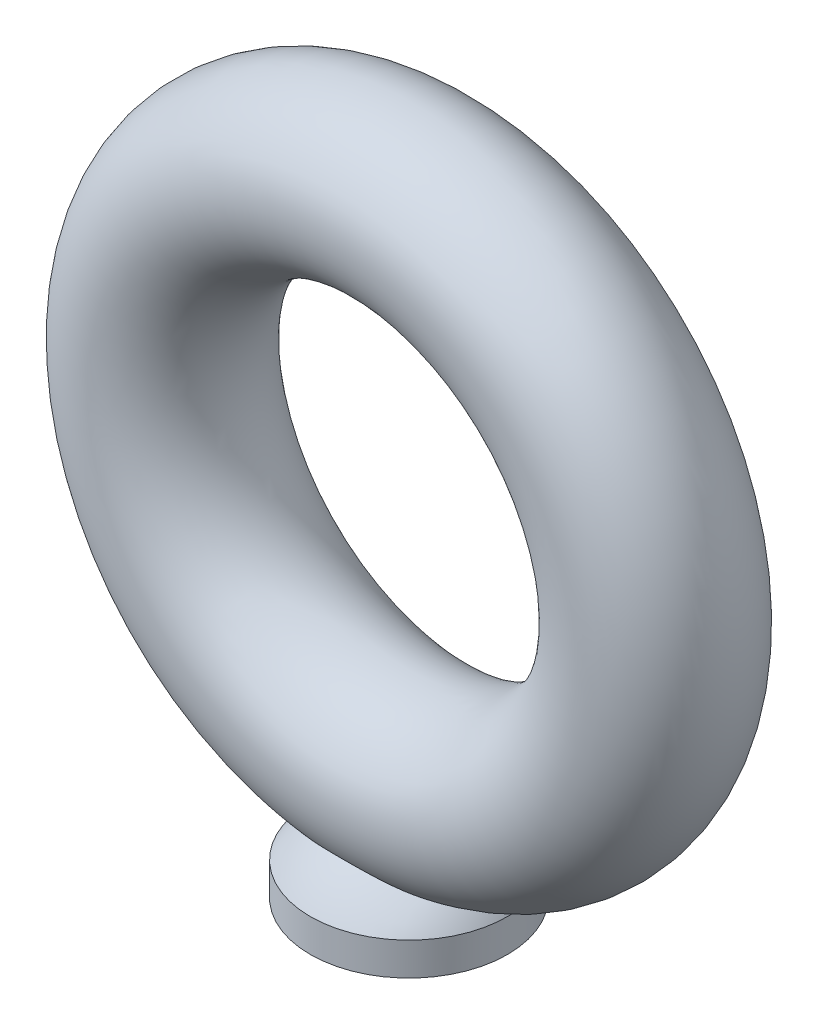
ISO-10303-21;
HEADER;
FILE_DESCRIPTION(('STEP AP214'),'2;1');
FILE_NAME('part.step','',(''),(''),'','','');
FILE_SCHEMA(('AUTOMOTIVE_DESIGN { 1 0 10303 214 1 1 1 1 }'));
ENDSEC;
DATA;
#1=APPLICATION_CONTEXT('core data for automotive mechanical design processes');
#2=APPLICATION_PROTOCOL_DEFINITION('international standard','automotive_design',2000,#1);
#3=PRODUCT_CONTEXT('',#1,'mechanical');
#4=PRODUCT('Part','Part','',(#3));
#5=PRODUCT_RELATED_PRODUCT_CATEGORY('part','',(#4));
#6=PRODUCT_DEFINITION_FORMATION('','',#4);
#7=PRODUCT_DEFINITION_CONTEXT('part definition',#1,'design');
#8=PRODUCT_DEFINITION('design','',#6,#7);
#9=PRODUCT_DEFINITION_SHAPE('','',#8);
#10=(LENGTH_UNIT() NAMED_UNIT(*) SI_UNIT(.MILLI.,.METRE.));
#11=(NAMED_UNIT(*) PLANE_ANGLE_UNIT() SI_UNIT($,.RADIAN.));
#12=(NAMED_UNIT(*) SI_UNIT($,.STERADIAN.) SOLID_ANGLE_UNIT());
#13=UNCERTAINTY_MEASURE_WITH_UNIT(LENGTH_MEASURE(1.E-05),#10,'distance_accuracy_value','');
#14=(GEOMETRIC_REPRESENTATION_CONTEXT(3) GLOBAL_UNCERTAINTY_ASSIGNED_CONTEXT((#13)) GLOBAL_UNIT_ASSIGNED_CONTEXT((#10,
#11,#12)) REPRESENTATION_CONTEXT('',''));
#15=CARTESIAN_POINT('',(0.,0.,0.));
#16=DIRECTION('',(0.,0.,1.));
#17=DIRECTION('',(1.,0.,0.));
#18=AXIS2_PLACEMENT_3D('',#15,#16,#17);
#19=CARTESIAN_POINT('',(0.,47.625,0.));
#20=DIRECTION('',(0.,1.,0.));
#21=DIRECTION('',(0.,0.,1.));
#22=AXIS2_PLACEMENT_3D('',#19,#20,#21);
#23=PLANE('',#22);
#24=CARTESIAN_POINT('',(0.,47.625,0.));
#25=DIRECTION('',(0.,-1.,0.));
#26=DIRECTION('',(0.,0.,-1.));
#27=AXIS2_PLACEMENT_3D('',#24,#25,#26);
#28=CIRCLE('',#27,4.7625);
#29=CARTESIAN_POINT('',(0.,47.625,-4.7625));
#30=VERTEX_POINT('',#29);
#31=EDGE_CURVE('E10',#30,#30,#28,.F.);
#32=ORIENTED_EDGE('',*,*,#31,.F.);
#33=EDGE_LOOP('',(#32));
#34=FACE_BOUND('',#33,.T.);
#35=ADVANCED_FACE('F43',(#34),#23,.F.);
#36=CARTESIAN_POINT('',(0.,65.0875,0.));
#37=DIRECTION('',(0.,0.,-1.));
#38=DIRECTION('',(-1.,0.,0.));
#39=AXIS2_PLACEMENT_3D('',#36,#37,#38);
#40=TOROIDAL_SURFACE('',#39,11.90625,3.96875);
#41=CARTESIAN_POINT('',(-3.08254351748566,50.3024240932503,-2.35197364086265));
#42=CARTESIAN_POINT('',(-2.98323900620474,50.3360213661932,-2.42422682434512));
#43=CARTESIAN_POINT('',(-2.88013085526119,50.3695590508059,-2.49121885892036));
#44=CARTESIAN_POINT('',(-2.66757504253659,50.4353566365679,-2.61511560413417));
#45=CARTESIAN_POINT('',(-2.5581237343341,50.4676157844336,-2.6720144347398));
#46=CARTESIAN_POINT('',(-2.33387453628399,50.5298358133464,-2.77631967020259));
#47=CARTESIAN_POINT('',(-2.2190652895459,50.559791419741,-2.82370466751601));
#48=CARTESIAN_POINT('',(-1.98536470315413,50.6163797260913,-2.90943601767067));
#49=CARTESIAN_POINT('',(-1.86647395179116,50.6430129023849,-2.94778366690226));
#50=CARTESIAN_POINT('',(-1.6265350316443,50.6919402792694,-3.01577583199314));
#51=CARTESIAN_POINT('',(-1.50551473902482,50.7142703118461,-3.04549336737173));
#52=CARTESIAN_POINT('',(-1.26108413917767,50.7542277139034,-3.09723231569982));
#53=CARTESIAN_POINT('',(-1.13767382490844,50.7718550695265,-3.11925370597103));
#54=CARTESIAN_POINT('',(-0.889224781194679,50.8018900136239,-3.15606193508245));
#55=CARTESIAN_POINT('',(-0.764186978633435,50.8143004497207,-3.17085272142225));
#56=CARTESIAN_POINT('',(-0.513061769559954,50.8335602457176,-3.19356299922371));
#57=CARTESIAN_POINT('',(-0.386974295520307,50.8404092450026,-3.20148204510987));
#58=CARTESIAN_POINT('',(-0.113139153931936,50.8490109200845,-3.21141606924612));
#59=CARTESIAN_POINT('',(0.0346881073914115,50.8497138838034,-3.21221539812763));
#60=CARTESIAN_POINT('',(0.329957871035442,50.8432236928687,-3.20473784428457));
#61=CARTESIAN_POINT('',(0.477400311437924,50.8360293376319,-3.19645958154691));
#62=CARTESIAN_POINT('',(0.77096716537377,50.8140214826774,-3.170537235227));
#63=CARTESIAN_POINT('',(0.917090868553502,50.7992041000513,-3.15288837843911));
#64=CARTESIAN_POINT('',(1.2068867008809,50.7625300339029,-3.10766175714483));
#65=CARTESIAN_POINT('',(1.35055928097147,50.740674660219,-3.08008584004837));
#66=CARTESIAN_POINT('',(1.61224879264925,50.6946736966398,-3.01934534193814));
#67=CARTESIAN_POINT('',(1.73077962122916,50.6714134282128,-2.98771771992849));
#68=CARTESIAN_POINT('',(1.96458073150071,50.6211486910837,-2.91625168244878));
#69=CARTESIAN_POINT('',(2.07985007047717,50.5941431528786,-2.87641092003966));
#70=CARTESIAN_POINT('',(2.30604860964035,50.5372254603831,-2.78800409491287));
#71=CARTESIAN_POINT('',(2.41698457070242,50.5073181101203,-2.73945234400102));
#72=CARTESIAN_POINT('',(2.63370411156787,50.4454762321496,-2.633036433247));
#73=CARTESIAN_POINT('',(2.73948753995918,50.4135416449328,-2.5751719999576));
#74=CARTESIAN_POINT('',(2.9997951731237,50.3312691829305,-2.41598632900276));
#75=CARTESIAN_POINT('',(3.15011624076264,50.2802264156832,-2.30797840401908));
#76=CARTESIAN_POINT('',(3.43091915698975,50.1800120436636,-2.0679835174725));
#77=CARTESIAN_POINT('',(3.56142338735529,50.1308383756635,-1.93602398320573));
#78=CARTESIAN_POINT('',(3.77793587024799,50.0464391425933,-1.67224075274156));
#79=CARTESIAN_POINT('',(3.86772687373571,50.0102439343324,-1.54384600092241));
#80=CARTESIAN_POINT('',(4.02590197356534,49.9452111201476,-1.272705449838));
#81=CARTESIAN_POINT('',(4.09429325249381,49.9163710461545,-1.12996448702182));
#82=CARTESIAN_POINT('',(4.2067204755041,49.8684048863484,-0.832668653452249));
#83=CARTESIAN_POINT('',(4.25062357495865,49.8493318299839,-0.678054423684553));
#84=CARTESIAN_POINT('',(4.31104873058692,49.8229716396619,-0.362581254168845));
#85=CARTESIAN_POINT('',(4.32758234656288,49.8156795299235,-0.201724980211858));
#86=CARTESIAN_POINT('',(4.33210648316943,49.8136876657442,0.104844256498268));
#87=CARTESIAN_POINT('',(4.32270112211044,49.8178390337092,0.250518306367766));
#88=CARTESIAN_POINT('',(4.28127538068227,49.8359756446295,0.537947191617793));
#89=CARTESIAN_POINT('',(4.24925870643447,49.8499592760199,0.679702665318849));
#90=CARTESIAN_POINT('',(4.16460219182563,49.8864313816903,0.953844533788829));
#91=CARTESIAN_POINT('',(4.11220825243776,49.9088183412131,1.08632120618424));
#92=CARTESIAN_POINT('',(3.98893736841063,49.960484662226,1.3408682250622));
#93=CARTESIAN_POINT('',(3.91805659998418,49.9897654495029,1.4629364117304));
#94=CARTESIAN_POINT('',(3.75344472935765,50.0560535946237,1.70482039563129));
#95=CARTESIAN_POINT('',(3.65826476899288,50.0935108804176,1.82352214552297));
#96=CARTESIAN_POINT('',(3.45227860403745,50.1716985292895,2.04517424877357));
#97=CARTESIAN_POINT('',(3.34146337458692,50.2124307768312,2.14811543288703));
#98=CARTESIAN_POINT('',(3.0546132818696,50.313124158797,2.38065783919074));
#99=CARTESIAN_POINT('',(2.87161842880009,50.3735159223365,2.50150869346071));
#100=CARTESIAN_POINT('',(2.48667739418103,50.4891713239009,2.71167199061192));
#101=CARTESIAN_POINT('',(2.28469036177215,50.5444233747835,2.80091438695586));
#102=CARTESIAN_POINT('',(1.94498305570274,50.6257710655533,2.92330062174467));
#103=CARTESIAN_POINT('',(1.81100402440017,50.65510868917,2.96499889368602));
#104=CARTESIAN_POINT('',(1.53914682219947,50.7084237679269,3.0379784155506));
#105=CARTESIAN_POINT('',(1.40126767309999,50.7323998646529,3.06925702649477));
#106=CARTESIAN_POINT('',(1.12275006223116,50.7740788900322,3.12216068821156));
#107=CARTESIAN_POINT('',(0.982111474602416,50.7917815318447,3.14378529758671));
#108=CARTESIAN_POINT('',(0.69905975461029,50.8202613929095,3.17799954275728));
#109=CARTESIAN_POINT('',(0.556646745553719,50.831039090679,3.19058980283784));
#110=CARTESIAN_POINT('',(0.269644892286703,50.8453375948838,3.20720410396355));
#111=CARTESIAN_POINT('',(0.125048079488628,50.8487908054769,3.21114836430517));
#112=CARTESIAN_POINT('',(-0.164107079244691,50.8481097540663,3.2103653333554));
#113=CARTESIAN_POINT('',(-0.308665424271491,50.8439753264595,3.20563785279995));
#114=CARTESIAN_POINT('',(-0.596982613301204,50.8282651704763,3.18734515891926));
#115=CARTESIAN_POINT('',(-0.740740377297934,50.8166810916601,3.17377002788285));
#116=CARTESIAN_POINT('',(-1.02633799906518,50.7865005792734,3.1373450515063));
#117=CARTESIAN_POINT('',(-1.1681778371704,50.7679040738582,3.11449511114209));
#118=CARTESIAN_POINT('',(-1.45626870473157,50.72325919128,3.05740490515453));
#119=CARTESIAN_POINT('',(-1.60236281071762,50.6968721300303,3.02263172414101));
#120=CARTESIAN_POINT('',(-1.89001490205714,50.6382097732968,2.9411066513974));
#121=CARTESIAN_POINT('',(-2.03157185815956,50.6059331527284,2.89435206302579));
#122=CARTESIAN_POINT('',(-2.30821165664163,50.5369835670369,2.78794149737856));
#123=CARTESIAN_POINT('',(-2.44331126730793,50.5003229640647,2.7283214333756));
#124=CARTESIAN_POINT('',(-2.70553563017265,50.4242226180294,2.59514788215853));
#125=CARTESIAN_POINT('',(-2.83266629408669,50.3847849823372,2.52160489039366));
#126=CARTESIAN_POINT('',(-3.1037347866997,50.2962540398051,2.3419919053919));
#127=CARTESIAN_POINT('',(-3.24525602169038,50.2469376190358,2.23232569386334));
#128=CARTESIAN_POINT('',(-3.50880838130006,50.1508951480156,1.99041341642969));
#129=CARTESIAN_POINT('',(-3.63084848365082,50.1041679110787,1.85817780993441));
#130=CARTESIAN_POINT('',(-3.79573833596262,50.0390711515628,1.64332707387973));
#131=CARTESIAN_POINT('',(-3.84790074583274,50.0181068861143,1.56851896858983));
#132=CARTESIAN_POINT('',(-3.94518710371911,49.9784889160883,1.41390362291581));
#133=CARTESIAN_POINT('',(-3.99031485645922,49.9598339636411,1.33409911782325));
#134=CARTESIAN_POINT('',(-4.07284391565778,49.925363124534,1.17004090705623));
#135=CARTESIAN_POINT('',(-4.11024896281467,49.9095458638514,1.08578938036531));
#136=CARTESIAN_POINT('',(-4.1767352220645,49.881212366757,0.913569270478045));
#137=CARTESIAN_POINT('',(-4.20581812704791,49.8686954590281,0.825601447435125));
#138=CARTESIAN_POINT('',(-4.27249194738257,49.8398567252453,0.583749894116489));
#139=CARTESIAN_POINT('',(-4.30168761234169,49.8270474363192,0.427007744277888));
#140=CARTESIAN_POINT('',(-4.33262564515229,49.8134688220579,0.110449600316049));
#141=CARTESIAN_POINT('',(-4.33438533653421,49.8126918992886,-0.04936439035596));
#142=CARTESIAN_POINT('',(-4.31163298758188,49.8226845720882,-0.350917632646942));
#143=CARTESIAN_POINT('',(-4.28967650675317,49.8323310241465,-0.492894462951503));
#144=CARTESIAN_POINT('',(-4.22446875873016,49.8606661852957,-0.770887514276672));
#145=CARTESIAN_POINT('',(-4.18121849621334,49.8793544677767,-0.906904016186204));
#146=CARTESIAN_POINT('',(-4.07437951926365,49.9247604126904,-1.17195776324687));
#147=CARTESIAN_POINT('',(-4.01045748623113,49.9516091988441,-1.30083701275265));
#148=CARTESIAN_POINT('',(-3.86499890007115,50.011311099131,-1.54664098274553));
#149=CARTESIAN_POINT('',(-3.78345971100107,50.0441651116743,-1.66356391042326));
#150=CARTESIAN_POINT('',(-3.60565961846068,50.1136958298773,-1.88376680525864));
#151=CARTESIAN_POINT('',(-3.50943258575716,50.1503636802263,-1.98707716751679));
#152=CARTESIAN_POINT('',(-3.30464551700597,50.2255211990648,-2.17987903963588));
#153=CARTESIAN_POINT('',(-3.19608054788449,50.2640115926476,-2.26936498810713));
#154=CARTESIAN_POINT('',(-3.08254351748566,50.3024240932503,-2.35197364086265));
#155=B_SPLINE_CURVE_WITH_KNOTS('',3,(#41,#42,#43,#44,#45,#46,#47,#48,#49,#50,#51,#52,#53,#54,
#55,#56,#57,#58,#59,#60,#61,#62,#63,#64,#65,#66,#67,#68,#69,#70,#71,#72,#73,#74,#75,#76,#77,#78,
#79,#80,#81,#82,#83,#84,#85,#86,#87,#88,#89,#90,#91,#92,#93,#94,#95,#96,#97,#98,#99,#100,#101,
#102,#103,#104,#105,#106,#107,#108,#109,#110,#111,#112,#113,#114,#115,#116,#117,#118,#119,#120,
#121,#122,#123,#124,#125,#126,#127,#128,#129,#130,#131,#132,#133,#134,#135,#136,#137,#138,#139,
#140,#141,#142,#143,#144,#145,#146,#147,#148,#149,#150,#151,#152,#153,#154),.UNSPECIFIED.,.T.,
.F.,(4,2,2,2,2,2,2,2,2,2,2,2,2,2,2,2,2,2,2,2,2,2,2,2,2,2,2,2,2,2,2,2,2,2,2,2,2,2,2,2,2,2,2,2,2,
2,2,2,2,2,2,2,2,2,2,2,4),(0.,0.381768634637475,0.763758952308183,1.14659940271285,
1.52938490191176,1.90883041088622,2.28827703796572,2.66751627671962,3.04678010416288,
3.48977171672717,3.93283068404891,4.37611555416031,4.81931797228131,5.19356708840072,
5.56792329637161,5.94166999225118,6.31542766441559,6.88915491598399,7.46222928305148,
7.942629739229,8.42286878079,8.90568831930039,9.38830388159223,9.8242770806309,10.2601788377901,
10.6909759112574,11.1218621608882,11.5901281749785,12.0586655919195,12.7373459225097,
13.4175209817294,13.8470895716323,14.2767668754521,14.7064638228415,15.1361310747601,
15.5697466672078,16.0033717235939,16.4374836868434,16.8716000978526,17.3284064532168,
17.7853157118968,18.2409656620398,18.6962734898199,19.2512943060419,19.8060586020852,
20.0864321941729,20.3666536149171,20.6467389828426,20.9267673352236,21.4036845710159,
21.8803006611225,22.3102482678716,22.7401755908917,23.1774131422623,23.6147161600586,
24.0510255637476,24.4875100347656),.UNSPECIFIED.);
#156=CARTESIAN_POINT('',(-3.08254351748566,50.3024240932503,-2.35197364086265));
#157=VERTEX_POINT('',#156);
#158=EDGE_CURVE('E49',#157,#157,#155,.T.);
#159=ORIENTED_EDGE('',*,*,#158,.F.);
#160=EDGE_LOOP('',(#159));
#161=FACE_BOUND('',#160,.T.);
#162=ADVANCED_FACE('F62',(#161),#40,.T.);
#163=CARTESIAN_POINT('',(0.,46.2491666666667,0.));
#164=DIRECTION('',(0.,1.,0.));
#165=DIRECTION('',(1.,0.,0.));
#166=AXIS2_PLACEMENT_3D('',#163,#164,#165);
#167=SPHERICAL_SURFACE('',#166,5.60916666666667);
#168=CARTESIAN_POINT('',(0.,49.2125,0.));
#169=DIRECTION('',(0.,1.,0.));
#170=DIRECTION('',(0.,0.,1.));
#171=AXIS2_PLACEMENT_3D('',#168,#169,#170);
#172=CIRCLE('',#171,4.7625);
#173=CARTESIAN_POINT('',(0.,49.2125,4.7625));
#174=VERTEX_POINT('',#173);
#175=EDGE_CURVE('E53',#174,#174,#172,.T.);
#176=ORIENTED_EDGE('',*,*,#175,.T.);
#177=EDGE_LOOP('',(#176));
#178=FACE_BOUND('',#177,.T.);
#179=ORIENTED_EDGE('',*,*,#158,.T.);
#180=EDGE_LOOP('',(#179));
#181=FACE_BOUND('',#180,.T.);
#182=ADVANCED_FACE('F65',(#178,#181),#167,.T.);
#183=CARTESIAN_POINT('',(0.,53.18125,0.));
#184=DIRECTION('',(0.,1.,0.));
#185=DIRECTION('',(0.,0.,1.));
#186=AXIS2_PLACEMENT_3D('',#183,#184,#185);
#187=CYLINDRICAL_SURFACE('',#186,4.7625);
#188=ORIENTED_EDGE('',*,*,#175,.F.);
#189=EDGE_LOOP('',(#188));
#190=FACE_BOUND('',#189,.T.);
#191=ORIENTED_EDGE('',*,*,#31,.T.);
#192=EDGE_LOOP('',(#191));
#193=FACE_BOUND('',#192,.T.);
#194=ADVANCED_FACE('F68',(#190,#193),#187,.T.);
#195=CLOSED_SHELL('',(#35,#162,#182,#194));
#196=MANIFOLD_SOLID_BREP('B2',#195);
#197=ADVANCED_BREP_SHAPE_REPRESENTATION('',(#18,#196),#14);
#198=SHAPE_DEFINITION_REPRESENTATION(#9,#197);
ENDSEC;
END-ISO-10303-21;
